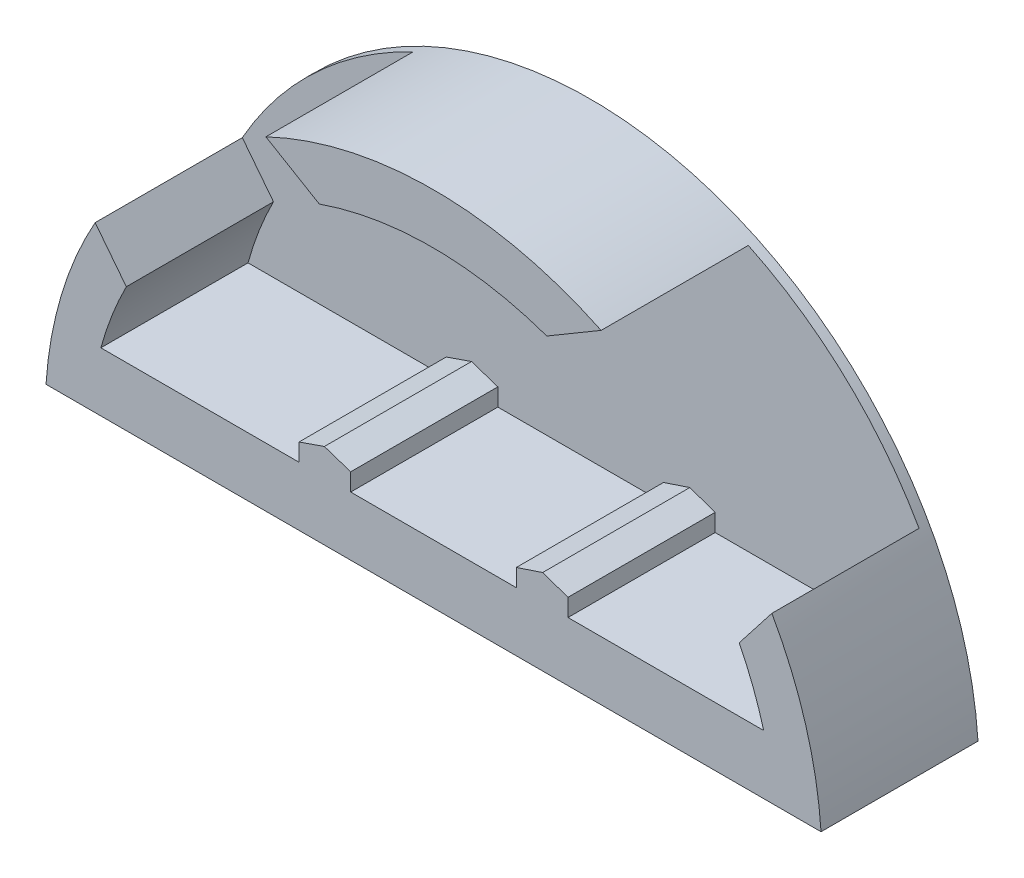
ISO-10303-21;
HEADER;
FILE_DESCRIPTION(('STEP AP214'),'2;1');
FILE_NAME('part.step','',(''),(''),'','','');
FILE_SCHEMA(('AUTOMOTIVE_DESIGN { 1 0 10303 214 1 1 1 1 }'));
ENDSEC;
DATA;
#1=APPLICATION_CONTEXT('core data for automotive mechanical design processes');
#2=APPLICATION_PROTOCOL_DEFINITION('international standard','automotive_design',2000,#1);
#3=PRODUCT_CONTEXT('',#1,'mechanical');
#4=PRODUCT('Part','Part','',(#3));
#5=PRODUCT_RELATED_PRODUCT_CATEGORY('part','',(#4));
#6=PRODUCT_DEFINITION_FORMATION('','',#4);
#7=PRODUCT_DEFINITION_CONTEXT('part definition',#1,'design');
#8=PRODUCT_DEFINITION('design','',#6,#7);
#9=PRODUCT_DEFINITION_SHAPE('','',#8);
#10=(LENGTH_UNIT() NAMED_UNIT(*) SI_UNIT(.MILLI.,.METRE.));
#11=(NAMED_UNIT(*) PLANE_ANGLE_UNIT() SI_UNIT($,.RADIAN.));
#12=(NAMED_UNIT(*) SI_UNIT($,.STERADIAN.) SOLID_ANGLE_UNIT());
#13=UNCERTAINTY_MEASURE_WITH_UNIT(LENGTH_MEASURE(1.E-05),#10,'distance_accuracy_value','');
#14=(GEOMETRIC_REPRESENTATION_CONTEXT(3) GLOBAL_UNCERTAINTY_ASSIGNED_CONTEXT((#13)) GLOBAL_UNIT_ASSIGNED_CONTEXT((#10,
#11,#12)) REPRESENTATION_CONTEXT('',''));
#15=CARTESIAN_POINT('',(0.,0.,0.));
#16=DIRECTION('',(0.,0.,1.));
#17=DIRECTION('',(1.,0.,0.));
#18=AXIS2_PLACEMENT_3D('',#15,#16,#17);
#19=CARTESIAN_POINT('',(0.,0.,3.2));
#20=DIRECTION('',(0.,0.,1.));
#21=DIRECTION('',(1.,0.,0.));
#22=AXIS2_PLACEMENT_3D('',#19,#20,#21);
#23=PLANE('',#22);
#24=DIRECTION('',(-0.861312005573637,0.508076400804759,0.));
#25=VECTOR('',#24,1.);
#26=CARTESIAN_POINT('',(-3.8663588439119,6.61080503991686,3.2));
#27=LINE('',#26,#25);
#28=CARTESIAN_POINT('',(-2.7773889019891,5.96843627564054,3.2));
#29=VERTEX_POINT('',#28);
#30=CARTESIAN_POINT('',(-3.8663588439119,6.61080503991686,3.2));
#31=VERTEX_POINT('',#30);
#32=EDGE_CURVE('E207',#29,#31,#27,.T.);
#33=ORIENTED_EDGE('',*,*,#32,.F.);
#34=CARTESIAN_POINT('',(-0.474329370102444,-0.647263744162207,3.2));
#35=DIRECTION('',(0.,0.,1.));
#36=DIRECTION('',(-1.,0.,0.));
#37=AXIS2_PLACEMENT_3D('',#34,#35,#36);
#38=CIRCLE('',#37,7.00511027460896);
#39=CARTESIAN_POINT('',(1.8603399516747,5.95734745691426,3.2));
#40=VERTEX_POINT('',#39);
#41=EDGE_CURVE('E315',#40,#29,#38,.T.);
#42=ORIENTED_EDGE('',*,*,#41,.F.);
#43=DIRECTION('',(-0.861312005573637,-0.508076400804759,0.));
#44=VECTOR('',#43,1.);
#45=CARTESIAN_POINT('',(2.96810811504892,6.61080503991686,3.2));
#46=LINE('',#45,#44);
#47=CARTESIAN_POINT('',(2.96810811504892,6.61080503991686,3.2));
#48=VERTEX_POINT('',#47);
#49=EDGE_CURVE('E224',#48,#40,#46,.T.);
#50=ORIENTED_EDGE('',*,*,#49,.F.);
#51=CARTESIAN_POINT('',(-0.449125364431487,-0.531688049222552,3.2));
#52=DIRECTION('',(0.,0.,1.));
#53=DIRECTION('',(1.,0.,0.));
#54=AXIS2_PLACEMENT_3D('',#51,#52,#53);
#55=CIRCLE('',#54,7.91787169520232);
#56=EDGE_CURVE('E342',#31,#48,#55,.F.);
#57=ORIENTED_EDGE('',*,*,#56,.F.);
#58=EDGE_LOOP('',(#33,#42,#50,#57));
#59=FACE_BOUND('',#58,.T.);
#60=ADVANCED_FACE('F43',(#59),#23,.T.);
#61=CARTESIAN_POINT('',(-0.474329370102444,-0.647263744162207,0.2));
#62=DIRECTION('',(0.,0.,1.));
#63=DIRECTION('',(1.,0.,0.));
#64=AXIS2_PLACEMENT_3D('',#61,#62,#63);
#65=CYLINDRICAL_SURFACE('',#64,7.00511027460896);
#66=ORIENTED_EDGE('',*,*,#41,.T.);
#67=DIRECTION('',(0.,0.,1.));
#68=VECTOR('',#67,1.);
#69=CARTESIAN_POINT('',(-2.7773889019891,5.96843627564054,0.2));
#70=LINE('',#69,#68);
#71=CARTESIAN_POINT('',(-2.7773889019891,5.96843627564054,0.2));
#72=VERTEX_POINT('',#71);
#73=EDGE_CURVE('E213',#72,#29,#70,.T.);
#74=ORIENTED_EDGE('',*,*,#73,.F.);
#75=CARTESIAN_POINT('',(-0.474329370102444,-0.647263744162207,0.2));
#76=DIRECTION('',(0.,0.,1.));
#77=DIRECTION('',(-1.,0.,0.));
#78=AXIS2_PLACEMENT_3D('',#75,#76,#77);
#79=CIRCLE('',#78,7.00511027460896);
#80=CARTESIAN_POINT('',(1.8603399516747,5.95734745691426,0.2));
#81=VERTEX_POINT('',#80);
#82=EDGE_CURVE('E280',#81,#72,#79,.T.);
#83=ORIENTED_EDGE('',*,*,#82,.F.);
#84=DIRECTION('',(0.,0.,1.));
#85=VECTOR('',#84,1.);
#86=CARTESIAN_POINT('',(1.8603399516747,5.95734745691426,0.2));
#87=LINE('',#86,#85);
#88=EDGE_CURVE('E237',#81,#40,#87,.T.);
#89=ORIENTED_EDGE('',*,*,#88,.T.);
#90=EDGE_LOOP('',(#66,#74,#83,#89));
#91=FACE_BOUND('',#90,.T.);
#92=ADVANCED_FACE('F373',(#91),#65,.F.);
#93=CARTESIAN_POINT('',(-6.71163372497658,2.54140437028624,0.2));
#94=VERTEX_POINT('',#93);
#95=CARTESIAN_POINT('',(-7.23055011128946,1.20342565597668,0.2));
#96=VERTEX_POINT('',#95);
#97=EDGE_CURVE('E275',#94,#96,#79,.T.);
#98=ORIENTED_EDGE('',*,*,#97,.F.);
#99=DIRECTION('',(0.,0.,1.));
#100=VECTOR('',#99,1.);
#101=CARTESIAN_POINT('',(-6.71163372497658,2.54140437028624,0.2));
#102=LINE('',#101,#100);
#103=CARTESIAN_POINT('',(-6.71163372497658,2.54140437028624,3.2));
#104=VERTEX_POINT('',#103);
#105=EDGE_CURVE('E195',#94,#104,#102,.T.);
#106=ORIENTED_EDGE('',*,*,#105,.T.);
#107=CARTESIAN_POINT('',(-7.23055011128946,1.20342565597668,3.2));
#108=VERTEX_POINT('',#107);
#109=EDGE_CURVE('E312',#104,#108,#38,.T.);
#110=ORIENTED_EDGE('',*,*,#109,.T.);
#111=DIRECTION('',(0.,0.,1.));
#112=VECTOR('',#111,1.);
#113=CARTESIAN_POINT('',(-7.23055011128946,1.20342565597668,0.2));
#114=LINE('',#113,#112);
#115=EDGE_CURVE('E316',#96,#108,#114,.T.);
#116=ORIENTED_EDGE('',*,*,#115,.F.);
#117=EDGE_LOOP('',(#98,#106,#110,#116));
#118=FACE_BOUND('',#117,.T.);
#119=ADVANCED_FACE('F379',(#118),#65,.F.);
#120=CARTESIAN_POINT('',(-0.449125364431487,-0.531688049222552,3.2));
#121=DIRECTION('',(0.,0.,-1.));
#122=DIRECTION('',(-1.,0.,0.));
#123=AXIS2_PLACEMENT_3D('',#120,#121,#122);
#124=CYLINDRICAL_SURFACE('',#123,7.91787169520232);
#125=DIRECTION('',(0.,0.,1.));
#126=VECTOR('',#125,1.);
#127=CARTESIAN_POINT('',(-3.8663588439119,6.61080503991686,0.2));
#128=LINE('',#127,#126);
#129=CARTESIAN_POINT('',(-3.8663588439119,6.61080503991686,0.2));
#130=VERTEX_POINT('',#129);
#131=EDGE_CURVE('E238',#130,#31,#128,.T.);
#132=ORIENTED_EDGE('',*,*,#131,.T.);
#133=ORIENTED_EDGE('',*,*,#56,.T.);
#134=DIRECTION('',(0.,0.,1.));
#135=VECTOR('',#134,1.);
#136=CARTESIAN_POINT('',(2.96810811504892,6.61080503991686,0.2));
#137=LINE('',#136,#135);
#138=CARTESIAN_POINT('',(2.96810811504892,6.61080503991686,0.2));
#139=VERTEX_POINT('',#138);
#140=EDGE_CURVE('E222',#139,#48,#137,.T.);
#141=ORIENTED_EDGE('',*,*,#140,.F.);
#142=CARTESIAN_POINT('',(-0.449125364431487,-0.53168804922255,0.2));
#143=DIRECTION('',(0.,0.,1.));
#144=DIRECTION('',(1.,0.,0.));
#145=AXIS2_PLACEMENT_3D('',#142,#143,#144);
#146=CIRCLE('',#145,7.91787169520232);
#147=CARTESIAN_POINT('',(6.4486623631407,3.35588402689906,0.2));
#148=VERTEX_POINT('',#147);
#149=EDGE_CURVE('E231',#148,#139,#146,.T.);
#150=ORIENTED_EDGE('',*,*,#149,.F.);
#151=DIRECTION('',(0.,0.,1.));
#152=VECTOR('',#151,1.);
#153=CARTESIAN_POINT('',(6.4486623631407,3.35588402689906,0.2));
#154=LINE('',#153,#152);
#155=CARTESIAN_POINT('',(6.4486623631407,3.35588402689906,3.2));
#156=VERTEX_POINT('',#155);
#157=EDGE_CURVE('E218',#148,#156,#154,.T.);
#158=ORIENTED_EDGE('',*,*,#157,.T.);
#159=CARTESIAN_POINT('',(7.45087463556851,0.,3.2));
#160=VERTEX_POINT('',#159);
#161=EDGE_CURVE('E343',#156,#160,#55,.F.);
#162=ORIENTED_EDGE('',*,*,#161,.T.);
#163=DIRECTION('',(0.,0.,-1.));
#164=VECTOR('',#163,1.);
#165=CARTESIAN_POINT('',(7.45087463556851,0.,3.2));
#166=LINE('',#165,#164);
#167=CARTESIAN_POINT('',(7.45087463556851,0.,0.));
#168=VERTEX_POINT('',#167);
#169=EDGE_CURVE('E51',#160,#168,#166,.T.);
#170=ORIENTED_EDGE('',*,*,#169,.T.);
#171=CARTESIAN_POINT('',(-0.449125364431487,-0.531688049222552,0.));
#172=DIRECTION('',(0.,0.,1.));
#173=DIRECTION('',(1.,0.,0.));
#174=AXIS2_PLACEMENT_3D('',#171,#172,#173);
#175=CIRCLE('',#174,7.91787169520232);
#176=CARTESIAN_POINT('',(-8.34912536443149,0.,0.));
#177=VERTEX_POINT('',#176);
#178=EDGE_CURVE('E318',#177,#168,#175,.F.);
#179=ORIENTED_EDGE('',*,*,#178,.F.);
#180=DIRECTION('',(0.,0.,-1.));
#181=VECTOR('',#180,1.);
#182=CARTESIAN_POINT('',(-8.34912536443149,0.,3.2));
#183=LINE('',#182,#181);
#184=CARTESIAN_POINT('',(-8.34912536443149,0.,3.2));
#185=VERTEX_POINT('',#184);
#186=EDGE_CURVE('E11',#185,#177,#183,.T.);
#187=ORIENTED_EDGE('',*,*,#186,.F.);
#188=CARTESIAN_POINT('',(-7.34691309200368,3.35588402689906,3.2));
#189=VERTEX_POINT('',#188);
#190=EDGE_CURVE('E211',#185,#189,#55,.F.);
#191=ORIENTED_EDGE('',*,*,#190,.T.);
#192=DIRECTION('',(0.,0.,1.));
#193=VECTOR('',#192,1.);
#194=CARTESIAN_POINT('',(-7.34691309200368,3.35588402689906,0.2));
#195=LINE('',#194,#193);
#196=CARTESIAN_POINT('',(-7.34691309200368,3.35588402689906,0.2));
#197=VERTEX_POINT('',#196);
#198=EDGE_CURVE('E192',#197,#189,#195,.T.);
#199=ORIENTED_EDGE('',*,*,#198,.F.);
#200=CARTESIAN_POINT('',(-0.449125364431487,-0.53168804922255,0.2));
#201=DIRECTION('',(0.,0.,1.));
#202=DIRECTION('',(-1.,0.,0.));
#203=AXIS2_PLACEMENT_3D('',#200,#201,#202);
#204=CIRCLE('',#203,7.91787169520232);
#205=EDGE_CURVE('E198',#130,#197,#204,.T.);
#206=ORIENTED_EDGE('',*,*,#205,.F.);
#207=EDGE_LOOP('',(#132,#133,#141,#150,#158,#162,#170,#179,#187,#191,#199,#206));
#208=FACE_BOUND('',#207,.T.);
#209=ADVANCED_FACE('F45',(#208),#124,.T.);
#210=CARTESIAN_POINT('',(0.,0.,3.2));
#211=DIRECTION('',(0.,1.,0.));
#212=DIRECTION('',(0.,0.,1.));
#213=AXIS2_PLACEMENT_3D('',#210,#211,#212);
#214=PLANE('',#213);
#215=DIRECTION('',(1.,0.,0.));
#216=VECTOR('',#215,1.);
#217=CARTESIAN_POINT('',(0.,0.,0.));
#218=LINE('',#217,#216);
#219=EDGE_CURVE('E348',#177,#168,#218,.T.);
#220=ORIENTED_EDGE('',*,*,#219,.T.);
#221=ORIENTED_EDGE('',*,*,#169,.F.);
#222=DIRECTION('',(1.,0.,0.));
#223=VECTOR('',#222,1.);
#224=CARTESIAN_POINT('',(0.,0.,3.2));
#225=LINE('',#224,#223);
#226=EDGE_CURVE('E341',#185,#160,#225,.T.);
#227=ORIENTED_EDGE('',*,*,#226,.F.);
#228=ORIENTED_EDGE('',*,*,#186,.T.);
#229=EDGE_LOOP('',(#220,#221,#227,#228));
#230=FACE_BOUND('',#229,.T.);
#231=ADVANCED_FACE('F356',(#230),#214,.F.);
#232=DIRECTION('',(0.615022911356013,-0.788509238060768,0.));
#233=VECTOR('',#232,1.);
#234=CARTESIAN_POINT('',(-6.71163372497658,2.54140437028624,3.2));
#235=LINE('',#234,#233);
#236=EDGE_CURVE('E229',#189,#104,#235,.T.);
#237=ORIENTED_EDGE('',*,*,#236,.F.);
#238=ORIENTED_EDGE('',*,*,#190,.F.);
#239=ORIENTED_EDGE('',*,*,#226,.T.);
#240=ORIENTED_EDGE('',*,*,#161,.F.);
#241=DIRECTION('',(0.615022911356013,0.788509238060768,0.));
#242=VECTOR('',#241,1.);
#243=CARTESIAN_POINT('',(5.77821970614686,2.49632218152963,3.2));
#244=LINE('',#243,#242);
#245=CARTESIAN_POINT('',(5.78283957433467,2.50224522712265,3.2));
#246=VERTEX_POINT('',#245);
#247=EDGE_CURVE('E226',#246,#156,#244,.T.);
#248=ORIENTED_EDGE('',*,*,#247,.F.);
#249=CARTESIAN_POINT('',(6.28189137108457,1.20342565597668,3.2));
#250=VERTEX_POINT('',#249);
#251=EDGE_CURVE('E245',#250,#246,#38,.T.);
#252=ORIENTED_EDGE('',*,*,#251,.F.);
#253=DIRECTION('',(1.,0.,0.));
#254=VECTOR('',#253,1.);
#255=CARTESIAN_POINT('',(2.29255265114636,1.20342565597668,3.2));
#256=LINE('',#255,#254);
#257=CARTESIAN_POINT('',(2.29255265114636,1.20342565597668,3.2));
#258=VERTEX_POINT('',#257);
#259=EDGE_CURVE('E309',#258,#250,#256,.T.);
#260=ORIENTED_EDGE('',*,*,#259,.F.);
#261=DIRECTION('',(0.,-1.,0.));
#262=VECTOR('',#261,1.);
#263=CARTESIAN_POINT('',(2.29255265114636,1.56095957900175,3.2));
#264=LINE('',#263,#262);
#265=CARTESIAN_POINT('',(2.29255265114636,1.56095957900175,3.2));
#266=VERTEX_POINT('',#265);
#267=EDGE_CURVE('E306',#266,#258,#264,.T.);
#268=ORIENTED_EDGE('',*,*,#267,.F.);
#269=DIRECTION('',(0.944986073440259,-0.327110563883164,0.));
#270=VECTOR('',#269,1.);
#271=CARTESIAN_POINT('',(1.77592776258166,1.73979127119722,3.2));
#272=LINE('',#271,#270);
#273=CARTESIAN_POINT('',(1.77592776258166,1.73979127119722,3.2));
#274=VERTEX_POINT('',#273);
#275=EDGE_CURVE('E303',#274,#266,#272,.T.);
#276=ORIENTED_EDGE('',*,*,#275,.F.);
#277=DIRECTION('',(0.948683298050513,0.316227766016839,0.));
#278=VECTOR('',#277,1.);
#279=CARTESIAN_POINT('',(1.23943268599524,1.56095957900175,3.2));
#280=LINE('',#279,#278);
#281=CARTESIAN_POINT('',(1.23943268599524,1.56095957900175,3.2));
#282=VERTEX_POINT('',#281);
#283=EDGE_CURVE('E300',#282,#274,#280,.T.);
#284=ORIENTED_EDGE('',*,*,#283,.F.);
#285=DIRECTION('',(0.,1.,0.));
#286=VECTOR('',#285,1.);
#287=CARTESIAN_POINT('',(1.23943268599524,1.20342565597668,3.2));
#288=LINE('',#287,#286);
#289=CARTESIAN_POINT('',(1.23943268599524,1.20342565597668,3.2));
#290=VERTEX_POINT('',#289);
#291=EDGE_CURVE('E297',#290,#282,#288,.T.);
#292=ORIENTED_EDGE('',*,*,#291,.F.);
#293=DIRECTION('',(1.,0.,0.));
#294=VECTOR('',#293,1.);
#295=CARTESIAN_POINT('',(-2.13768341485821,1.20342565597668,3.2));
#296=LINE('',#295,#294);
#297=CARTESIAN_POINT('',(-2.13768341485821,1.20342565597668,3.2));
#298=VERTEX_POINT('',#297);
#299=EDGE_CURVE('E294',#298,#290,#296,.T.);
#300=ORIENTED_EDGE('',*,*,#299,.F.);
#301=DIRECTION('',(0.,-1.,0.));
#302=VECTOR('',#301,1.);
#303=CARTESIAN_POINT('',(-2.13768341485821,1.56095957900175,3.2));
#304=LINE('',#303,#302);
#305=CARTESIAN_POINT('',(-2.13768341485821,1.56095957900175,3.2));
#306=VERTEX_POINT('',#305);
#307=EDGE_CURVE('E291',#306,#298,#304,.T.);
#308=ORIENTED_EDGE('',*,*,#307,.F.);
#309=DIRECTION('',(0.948683298050513,-0.316227766016839,0.));
#310=VECTOR('',#309,1.);
#311=CARTESIAN_POINT('',(-2.67417849144463,1.73979127119722,3.2));
#312=LINE('',#311,#310);
#313=CARTESIAN_POINT('',(-2.67417849144463,1.73979127119722,3.2));
#314=VERTEX_POINT('',#313);
#315=EDGE_CURVE('E288',#314,#306,#312,.T.);
#316=ORIENTED_EDGE('',*,*,#315,.F.);
#317=DIRECTION('',(0.944986073440259,0.327110563883164,0.));
#318=VECTOR('',#317,1.);
#319=CARTESIAN_POINT('',(-3.19080338000934,1.56095957900175,3.2));
#320=LINE('',#319,#318);
#321=CARTESIAN_POINT('',(-3.19080338000934,1.56095957900175,3.2));
#322=VERTEX_POINT('',#321);
#323=EDGE_CURVE('E285',#322,#314,#320,.T.);
#324=ORIENTED_EDGE('',*,*,#323,.F.);
#325=DIRECTION('',(0.,1.,0.));
#326=VECTOR('',#325,1.);
#327=CARTESIAN_POINT('',(-3.19080338000934,1.20342565597668,3.2));
#328=LINE('',#327,#326);
#329=CARTESIAN_POINT('',(-3.19080338000934,1.20342565597668,3.2));
#330=VERTEX_POINT('',#329);
#331=EDGE_CURVE('E282',#330,#322,#328,.T.);
#332=ORIENTED_EDGE('',*,*,#331,.F.);
#333=DIRECTION('',(1.,0.,0.));
#334=VECTOR('',#333,1.);
#335=CARTESIAN_POINT('',(-3.19080338000934,1.20342565597668,3.2));
#336=LINE('',#335,#334);
#337=EDGE_CURVE('E66',#108,#330,#336,.T.);
#338=ORIENTED_EDGE('',*,*,#337,.F.);
#339=ORIENTED_EDGE('',*,*,#109,.F.);
#340=EDGE_LOOP('',(#237,#238,#239,#240,#248,#252,#260,#268,#276,#284,#292,#300,#308,#316,#324,
#332,#338,#339));
#341=FACE_BOUND('',#340,.T.);
#342=ADVANCED_FACE('F361',(#341),#23,.T.);
#343=CARTESIAN_POINT('',(0.,0.,0.));
#344=DIRECTION('',(0.,0.,1.));
#345=DIRECTION('',(1.,0.,0.));
#346=AXIS2_PLACEMENT_3D('',#343,#344,#345);
#347=PLANE('',#346);
#348=ORIENTED_EDGE('',*,*,#178,.T.);
#349=ORIENTED_EDGE('',*,*,#219,.F.);
#350=EDGE_LOOP('',(#348,#349));
#351=FACE_BOUND('',#350,.T.);
#352=ADVANCED_FACE('F358',(#351),#347,.F.);
#353=CARTESIAN_POINT('',(-3.19080338000934,1.20342565597668,0.2));
#354=DIRECTION('',(0.,-1.,0.));
#355=DIRECTION('',(0.,0.,-1.));
#356=AXIS2_PLACEMENT_3D('',#353,#354,#355);
#357=PLANE('',#356);
#358=ORIENTED_EDGE('',*,*,#337,.T.);
#359=DIRECTION('',(0.,0.,1.));
#360=VECTOR('',#359,1.);
#361=CARTESIAN_POINT('',(-3.19080338000934,1.20342565597668,0.2));
#362=LINE('',#361,#360);
#363=CARTESIAN_POINT('',(-3.19080338000934,1.20342565597668,0.2));
#364=VERTEX_POINT('',#363);
#365=EDGE_CURVE('E279',#364,#330,#362,.T.);
#366=ORIENTED_EDGE('',*,*,#365,.F.);
#367=DIRECTION('',(1.,0.,0.));
#368=VECTOR('',#367,1.);
#369=CARTESIAN_POINT('',(-3.19080338000934,1.20342565597668,0.2));
#370=LINE('',#369,#368);
#371=EDGE_CURVE('E241',#96,#364,#370,.T.);
#372=ORIENTED_EDGE('',*,*,#371,.F.);
#373=ORIENTED_EDGE('',*,*,#115,.T.);
#374=EDGE_LOOP('',(#358,#366,#372,#373));
#375=FACE_BOUND('',#374,.T.);
#376=ADVANCED_FACE('F360',(#375),#357,.F.);
#377=ORIENTED_EDGE('',*,*,#251,.T.);
#378=DIRECTION('',(0.,0.,1.));
#379=VECTOR('',#378,1.);
#380=CARTESIAN_POINT('',(5.78283957433467,2.50224522712265,0.2));
#381=LINE('',#380,#379);
#382=CARTESIAN_POINT('',(5.78283957433467,2.50224522712265,0.2));
#383=VERTEX_POINT('',#382);
#384=EDGE_CURVE('E234',#246,#383,#381,.F.);
#385=ORIENTED_EDGE('',*,*,#384,.T.);
#386=CARTESIAN_POINT('',(6.28189137108457,1.20342565597668,0.2));
#387=VERTEX_POINT('',#386);
#388=EDGE_CURVE('E276',#387,#383,#79,.T.);
#389=ORIENTED_EDGE('',*,*,#388,.F.);
#390=DIRECTION('',(0.,0.,1.));
#391=VECTOR('',#390,1.);
#392=CARTESIAN_POINT('',(6.28189137108457,1.20342565597668,0.2));
#393=LINE('',#392,#391);
#394=EDGE_CURVE('E319',#387,#250,#393,.T.);
#395=ORIENTED_EDGE('',*,*,#394,.T.);
#396=EDGE_LOOP('',(#377,#385,#389,#395));
#397=FACE_BOUND('',#396,.T.);
#398=ADVANCED_FACE('F367',(#397),#65,.F.);
#399=CARTESIAN_POINT('',(2.29255265114636,1.20342565597668,0.2));
#400=DIRECTION('',(0.,-1.,0.));
#401=DIRECTION('',(0.,0.,-1.));
#402=AXIS2_PLACEMENT_3D('',#399,#400,#401);
#403=PLANE('',#402);
#404=ORIENTED_EDGE('',*,*,#259,.T.);
#405=ORIENTED_EDGE('',*,*,#394,.F.);
#406=DIRECTION('',(1.,0.,0.));
#407=VECTOR('',#406,1.);
#408=CARTESIAN_POINT('',(2.29255265114636,1.20342565597668,0.2));
#409=LINE('',#408,#407);
#410=CARTESIAN_POINT('',(2.29255265114636,1.20342565597668,0.2));
#411=VERTEX_POINT('',#410);
#412=EDGE_CURVE('E272',#411,#387,#409,.T.);
#413=ORIENTED_EDGE('',*,*,#412,.F.);
#414=DIRECTION('',(0.,0.,1.));
#415=VECTOR('',#414,1.);
#416=CARTESIAN_POINT('',(2.29255265114636,1.20342565597668,0.2));
#417=LINE('',#416,#415);
#418=EDGE_CURVE('E321',#411,#258,#417,.T.);
#419=ORIENTED_EDGE('',*,*,#418,.T.);
#420=EDGE_LOOP('',(#404,#405,#413,#419));
#421=FACE_BOUND('',#420,.T.);
#422=ADVANCED_FACE('F418',(#421),#403,.F.);
#423=CARTESIAN_POINT('',(2.29255265114636,1.56095957900175,0.2));
#424=DIRECTION('',(-1.,0.,0.));
#425=DIRECTION('',(0.,0.,1.));
#426=AXIS2_PLACEMENT_3D('',#423,#424,#425);
#427=PLANE('',#426);
#428=ORIENTED_EDGE('',*,*,#267,.T.);
#429=ORIENTED_EDGE('',*,*,#418,.F.);
#430=DIRECTION('',(0.,-1.,0.));
#431=VECTOR('',#430,1.);
#432=CARTESIAN_POINT('',(2.29255265114636,1.56095957900175,0.2));
#433=LINE('',#432,#431);
#434=CARTESIAN_POINT('',(2.29255265114636,1.56095957900175,0.2));
#435=VERTEX_POINT('',#434);
#436=EDGE_CURVE('E269',#435,#411,#433,.T.);
#437=ORIENTED_EDGE('',*,*,#436,.F.);
#438=DIRECTION('',(0.,0.,1.));
#439=VECTOR('',#438,1.);
#440=CARTESIAN_POINT('',(2.29255265114636,1.56095957900175,0.2));
#441=LINE('',#440,#439);
#442=EDGE_CURVE('E323',#435,#266,#441,.T.);
#443=ORIENTED_EDGE('',*,*,#442,.T.);
#444=EDGE_LOOP('',(#428,#429,#437,#443));
#445=FACE_BOUND('',#444,.T.);
#446=ADVANCED_FACE('F414',(#445),#427,.F.);
#447=CARTESIAN_POINT('',(1.77592776258166,1.73979127119722,0.2));
#448=DIRECTION('',(-0.327110563883164,-0.944986073440259,0.));
#449=DIRECTION('',(0.944986073440259,-0.327110563883164,0.));
#450=AXIS2_PLACEMENT_3D('',#447,#448,#449);
#451=PLANE('',#450);
#452=ORIENTED_EDGE('',*,*,#275,.T.);
#453=ORIENTED_EDGE('',*,*,#442,.F.);
#454=DIRECTION('',(0.944986073440259,-0.327110563883164,0.));
#455=VECTOR('',#454,1.);
#456=CARTESIAN_POINT('',(1.77592776258166,1.73979127119722,0.2));
#457=LINE('',#456,#455);
#458=CARTESIAN_POINT('',(1.77592776258166,1.73979127119722,0.2));
#459=VERTEX_POINT('',#458);
#460=EDGE_CURVE('E266',#459,#435,#457,.T.);
#461=ORIENTED_EDGE('',*,*,#460,.F.);
#462=DIRECTION('',(0.,0.,1.));
#463=VECTOR('',#462,1.);
#464=CARTESIAN_POINT('',(1.77592776258166,1.73979127119722,0.2));
#465=LINE('',#464,#463);
#466=EDGE_CURVE('E325',#459,#274,#465,.T.);
#467=ORIENTED_EDGE('',*,*,#466,.T.);
#468=EDGE_LOOP('',(#452,#453,#461,#467));
#469=FACE_BOUND('',#468,.T.);
#470=ADVANCED_FACE('F410',(#469),#451,.F.);
#471=CARTESIAN_POINT('',(1.23943268599524,1.56095957900175,0.2));
#472=DIRECTION('',(0.316227766016839,-0.948683298050514,0.));
#473=DIRECTION('',(0.948683298050514,0.316227766016839,0.));
#474=AXIS2_PLACEMENT_3D('',#471,#472,#473);
#475=PLANE('',#474);
#476=ORIENTED_EDGE('',*,*,#283,.T.);
#477=ORIENTED_EDGE('',*,*,#466,.F.);
#478=DIRECTION('',(0.948683298050513,0.316227766016839,0.));
#479=VECTOR('',#478,1.);
#480=CARTESIAN_POINT('',(1.23943268599524,1.56095957900175,0.2));
#481=LINE('',#480,#479);
#482=CARTESIAN_POINT('',(1.23943268599524,1.56095957900175,0.2));
#483=VERTEX_POINT('',#482);
#484=EDGE_CURVE('E263',#483,#459,#481,.T.);
#485=ORIENTED_EDGE('',*,*,#484,.F.);
#486=DIRECTION('',(0.,0.,1.));
#487=VECTOR('',#486,1.);
#488=CARTESIAN_POINT('',(1.23943268599524,1.56095957900175,0.2));
#489=LINE('',#488,#487);
#490=EDGE_CURVE('E327',#483,#282,#489,.T.);
#491=ORIENTED_EDGE('',*,*,#490,.T.);
#492=EDGE_LOOP('',(#476,#477,#485,#491));
#493=FACE_BOUND('',#492,.T.);
#494=ADVANCED_FACE('F406',(#493),#475,.F.);
#495=CARTESIAN_POINT('',(1.23943268599524,1.20342565597668,0.2));
#496=DIRECTION('',(1.,0.,0.));
#497=DIRECTION('',(0.,1.,0.));
#498=AXIS2_PLACEMENT_3D('',#495,#496,#497);
#499=PLANE('',#498);
#500=ORIENTED_EDGE('',*,*,#291,.T.);
#501=ORIENTED_EDGE('',*,*,#490,.F.);
#502=DIRECTION('',(0.,1.,0.));
#503=VECTOR('',#502,1.);
#504=CARTESIAN_POINT('',(1.23943268599524,1.20342565597668,0.2));
#505=LINE('',#504,#503);
#506=CARTESIAN_POINT('',(1.23943268599524,1.20342565597668,0.2));
#507=VERTEX_POINT('',#506);
#508=EDGE_CURVE('E260',#507,#483,#505,.T.);
#509=ORIENTED_EDGE('',*,*,#508,.F.);
#510=DIRECTION('',(0.,0.,1.));
#511=VECTOR('',#510,1.);
#512=CARTESIAN_POINT('',(1.23943268599524,1.20342565597668,0.2));
#513=LINE('',#512,#511);
#514=EDGE_CURVE('E329',#507,#290,#513,.T.);
#515=ORIENTED_EDGE('',*,*,#514,.T.);
#516=EDGE_LOOP('',(#500,#501,#509,#515));
#517=FACE_BOUND('',#516,.T.);
#518=ADVANCED_FACE('F402',(#517),#499,.F.);
#519=CARTESIAN_POINT('',(-2.13768341485821,1.20342565597668,0.2));
#520=DIRECTION('',(0.,-1.,0.));
#521=DIRECTION('',(0.,0.,-1.));
#522=AXIS2_PLACEMENT_3D('',#519,#520,#521);
#523=PLANE('',#522);
#524=ORIENTED_EDGE('',*,*,#299,.T.);
#525=ORIENTED_EDGE('',*,*,#514,.F.);
#526=DIRECTION('',(1.,0.,0.));
#527=VECTOR('',#526,1.);
#528=CARTESIAN_POINT('',(-2.13768341485821,1.20342565597668,0.2));
#529=LINE('',#528,#527);
#530=CARTESIAN_POINT('',(-2.13768341485821,1.20342565597668,0.2));
#531=VERTEX_POINT('',#530);
#532=EDGE_CURVE('E257',#531,#507,#529,.T.);
#533=ORIENTED_EDGE('',*,*,#532,.F.);
#534=DIRECTION('',(0.,0.,1.));
#535=VECTOR('',#534,1.);
#536=CARTESIAN_POINT('',(-2.13768341485821,1.20342565597668,0.2));
#537=LINE('',#536,#535);
#538=EDGE_CURVE('E331',#531,#298,#537,.T.);
#539=ORIENTED_EDGE('',*,*,#538,.T.);
#540=EDGE_LOOP('',(#524,#525,#533,#539));
#541=FACE_BOUND('',#540,.T.);
#542=ADVANCED_FACE('F398',(#541),#523,.F.);
#543=CARTESIAN_POINT('',(-2.13768341485821,1.56095957900175,0.2));
#544=DIRECTION('',(-1.,0.,0.));
#545=DIRECTION('',(0.,-1.,0.));
#546=AXIS2_PLACEMENT_3D('',#543,#544,#545);
#547=PLANE('',#546);
#548=ORIENTED_EDGE('',*,*,#307,.T.);
#549=ORIENTED_EDGE('',*,*,#538,.F.);
#550=DIRECTION('',(0.,-1.,0.));
#551=VECTOR('',#550,1.);
#552=CARTESIAN_POINT('',(-2.13768341485821,1.56095957900175,0.2));
#553=LINE('',#552,#551);
#554=CARTESIAN_POINT('',(-2.13768341485821,1.56095957900175,0.2));
#555=VERTEX_POINT('',#554);
#556=EDGE_CURVE('E254',#555,#531,#553,.T.);
#557=ORIENTED_EDGE('',*,*,#556,.F.);
#558=DIRECTION('',(0.,0.,1.));
#559=VECTOR('',#558,1.);
#560=CARTESIAN_POINT('',(-2.13768341485821,1.56095957900175,0.2));
#561=LINE('',#560,#559);
#562=EDGE_CURVE('E333',#555,#306,#561,.T.);
#563=ORIENTED_EDGE('',*,*,#562,.T.);
#564=EDGE_LOOP('',(#548,#549,#557,#563));
#565=FACE_BOUND('',#564,.T.);
#566=ADVANCED_FACE('F394',(#565),#547,.F.);
#567=CARTESIAN_POINT('',(-2.67417849144463,1.73979127119722,0.2));
#568=DIRECTION('',(-0.316227766016839,-0.948683298050514,0.));
#569=DIRECTION('',(0.948683298050514,-0.316227766016839,0.));
#570=AXIS2_PLACEMENT_3D('',#567,#568,#569);
#571=PLANE('',#570);
#572=ORIENTED_EDGE('',*,*,#315,.T.);
#573=ORIENTED_EDGE('',*,*,#562,.F.);
#574=DIRECTION('',(0.948683298050513,-0.316227766016839,0.));
#575=VECTOR('',#574,1.);
#576=CARTESIAN_POINT('',(-2.67417849144463,1.73979127119722,0.2));
#577=LINE('',#576,#575);
#578=CARTESIAN_POINT('',(-2.67417849144463,1.73979127119722,0.2));
#579=VERTEX_POINT('',#578);
#580=EDGE_CURVE('E251',#579,#555,#577,.T.);
#581=ORIENTED_EDGE('',*,*,#580,.F.);
#582=DIRECTION('',(0.,0.,1.));
#583=VECTOR('',#582,1.);
#584=CARTESIAN_POINT('',(-2.67417849144463,1.73979127119722,0.2));
#585=LINE('',#584,#583);
#586=EDGE_CURVE('E335',#579,#314,#585,.T.);
#587=ORIENTED_EDGE('',*,*,#586,.T.);
#588=EDGE_LOOP('',(#572,#573,#581,#587));
#589=FACE_BOUND('',#588,.T.);
#590=ADVANCED_FACE('F390',(#589),#571,.F.);
#591=CARTESIAN_POINT('',(-3.19080338000934,1.56095957900175,0.2));
#592=DIRECTION('',(0.327110563883164,-0.944986073440259,0.));
#593=DIRECTION('',(0.944986073440259,0.327110563883164,0.));
#594=AXIS2_PLACEMENT_3D('',#591,#592,#593);
#595=PLANE('',#594);
#596=ORIENTED_EDGE('',*,*,#323,.T.);
#597=ORIENTED_EDGE('',*,*,#586,.F.);
#598=DIRECTION('',(0.944986073440259,0.327110563883164,0.));
#599=VECTOR('',#598,1.);
#600=CARTESIAN_POINT('',(-3.19080338000934,1.56095957900175,0.2));
#601=LINE('',#600,#599);
#602=CARTESIAN_POINT('',(-3.19080338000934,1.56095957900175,0.2));
#603=VERTEX_POINT('',#602);
#604=EDGE_CURVE('E248',#603,#579,#601,.T.);
#605=ORIENTED_EDGE('',*,*,#604,.F.);
#606=DIRECTION('',(0.,0.,1.));
#607=VECTOR('',#606,1.);
#608=CARTESIAN_POINT('',(-3.19080338000934,1.56095957900175,0.2));
#609=LINE('',#608,#607);
#610=EDGE_CURVE('E337',#603,#322,#609,.T.);
#611=ORIENTED_EDGE('',*,*,#610,.T.);
#612=EDGE_LOOP('',(#596,#597,#605,#611));
#613=FACE_BOUND('',#612,.T.);
#614=ADVANCED_FACE('F386',(#613),#595,.F.);
#615=CARTESIAN_POINT('',(-3.19080338000934,1.20342565597668,0.2));
#616=DIRECTION('',(1.,0.,0.));
#617=DIRECTION('',(0.,0.,-1.));
#618=AXIS2_PLACEMENT_3D('',#615,#616,#617);
#619=PLANE('',#618);
#620=ORIENTED_EDGE('',*,*,#331,.T.);
#621=ORIENTED_EDGE('',*,*,#610,.F.);
#622=DIRECTION('',(0.,1.,0.));
#623=VECTOR('',#622,1.);
#624=CARTESIAN_POINT('',(-3.19080338000934,1.20342565597668,0.2));
#625=LINE('',#624,#623);
#626=EDGE_CURVE('E244',#364,#603,#625,.T.);
#627=ORIENTED_EDGE('',*,*,#626,.F.);
#628=ORIENTED_EDGE('',*,*,#365,.T.);
#629=EDGE_LOOP('',(#620,#621,#627,#628));
#630=FACE_BOUND('',#629,.T.);
#631=ADVANCED_FACE('F384',(#630),#619,.F.);
#632=CARTESIAN_POINT('',(-0.474329370102444,-0.647263744162207,0.2));
#633=DIRECTION('',(0.,0.,-1.));
#634=DIRECTION('',(-1.,0.,0.));
#635=AXIS2_PLACEMENT_3D('',#632,#633,#634);
#636=PLANE('',#635);
#637=DIRECTION('',(-0.861312005573637,-0.508076400804759,0.));
#638=VECTOR('',#637,1.);
#639=CARTESIAN_POINT('',(2.96810811504892,6.61080503991686,0.2));
#640=LINE('',#639,#638);
#641=EDGE_CURVE('E221',#139,#81,#640,.T.);
#642=ORIENTED_EDGE('',*,*,#641,.T.);
#643=ORIENTED_EDGE('',*,*,#82,.T.);
#644=DIRECTION('',(-0.861312005573637,0.508076400804759,0.));
#645=VECTOR('',#644,1.);
#646=CARTESIAN_POINT('',(-3.8663588439119,6.61080503991686,0.2));
#647=LINE('',#646,#645);
#648=EDGE_CURVE('E197',#72,#130,#647,.T.);
#649=ORIENTED_EDGE('',*,*,#648,.T.);
#650=ORIENTED_EDGE('',*,*,#205,.T.);
#651=DIRECTION('',(0.615022911356013,-0.788509238060768,0.));
#652=VECTOR('',#651,1.);
#653=CARTESIAN_POINT('',(-6.71163372497658,2.54140437028624,0.2));
#654=LINE('',#653,#652);
#655=EDGE_CURVE('E58',#197,#94,#654,.T.);
#656=ORIENTED_EDGE('',*,*,#655,.T.);
#657=ORIENTED_EDGE('',*,*,#97,.T.);
#658=ORIENTED_EDGE('',*,*,#371,.T.);
#659=ORIENTED_EDGE('',*,*,#626,.T.);
#660=ORIENTED_EDGE('',*,*,#604,.T.);
#661=ORIENTED_EDGE('',*,*,#580,.T.);
#662=ORIENTED_EDGE('',*,*,#556,.T.);
#663=ORIENTED_EDGE('',*,*,#532,.T.);
#664=ORIENTED_EDGE('',*,*,#508,.T.);
#665=ORIENTED_EDGE('',*,*,#484,.T.);
#666=ORIENTED_EDGE('',*,*,#460,.T.);
#667=ORIENTED_EDGE('',*,*,#436,.T.);
#668=ORIENTED_EDGE('',*,*,#412,.T.);
#669=ORIENTED_EDGE('',*,*,#388,.T.);
#670=DIRECTION('',(0.615022911356013,0.788509238060768,0.));
#671=VECTOR('',#670,1.);
#672=CARTESIAN_POINT('',(5.77821970614686,2.49632218152963,0.2));
#673=LINE('',#672,#671);
#674=EDGE_CURVE('E227',#383,#148,#673,.T.);
#675=ORIENTED_EDGE('',*,*,#674,.T.);
#676=ORIENTED_EDGE('',*,*,#149,.T.);
#677=EDGE_LOOP('',(#642,#643,#649,#650,#656,#657,#658,#659,#660,#661,#662,#663,#664,#665,#666,
#667,#668,#669,#675,#676));
#678=FACE_BOUND('',#677,.T.);
#679=ADVANCED_FACE('F203',(#678),#636,.F.);
#680=CARTESIAN_POINT('',(2.96810811504892,6.61080503991686,0.2));
#681=DIRECTION('',(-0.508076400804759,0.861312005573637,0.));
#682=DIRECTION('',(-0.861312005573637,-0.508076400804759,0.));
#683=AXIS2_PLACEMENT_3D('',#680,#681,#682);
#684=PLANE('',#683);
#685=ORIENTED_EDGE('',*,*,#641,.F.);
#686=ORIENTED_EDGE('',*,*,#140,.T.);
#687=ORIENTED_EDGE('',*,*,#49,.T.);
#688=ORIENTED_EDGE('',*,*,#88,.F.);
#689=EDGE_LOOP('',(#685,#686,#687,#688));
#690=FACE_BOUND('',#689,.T.);
#691=ADVANCED_FACE('F427',(#690),#684,.F.);
#692=CARTESIAN_POINT('',(5.77821970614686,2.49632218152963,0.2));
#693=DIRECTION('',(0.788509238060768,-0.615022911356013,0.));
#694=DIRECTION('',(0.615022911356013,0.788509238060769,0.));
#695=AXIS2_PLACEMENT_3D('',#692,#693,#694);
#696=PLANE('',#695);
#697=ORIENTED_EDGE('',*,*,#247,.T.);
#698=ORIENTED_EDGE('',*,*,#157,.F.);
#699=ORIENTED_EDGE('',*,*,#674,.F.);
#700=ORIENTED_EDGE('',*,*,#384,.F.);
#701=EDGE_LOOP('',(#697,#698,#699,#700));
#702=FACE_BOUND('',#701,.T.);
#703=ADVANCED_FACE('F430',(#702),#696,.F.);
#704=CARTESIAN_POINT('',(-3.8663588439119,6.61080503991686,0.2));
#705=DIRECTION('',(0.508076400804759,0.861312005573637,0.));
#706=DIRECTION('',(-0.861312005573637,0.508076400804759,0.));
#707=AXIS2_PLACEMENT_3D('',#704,#705,#706);
#708=PLANE('',#707);
#709=ORIENTED_EDGE('',*,*,#32,.T.);
#710=ORIENTED_EDGE('',*,*,#131,.F.);
#711=ORIENTED_EDGE('',*,*,#648,.F.);
#712=ORIENTED_EDGE('',*,*,#73,.T.);
#713=EDGE_LOOP('',(#709,#710,#711,#712));
#714=FACE_BOUND('',#713,.T.);
#715=ADVANCED_FACE('F434',(#714),#708,.F.);
#716=CARTESIAN_POINT('',(-6.71163372497658,2.54140437028624,0.2));
#717=DIRECTION('',(-0.788509238060768,-0.615022911356013,0.));
#718=DIRECTION('',(0.615022911356013,-0.788509238060768,0.));
#719=AXIS2_PLACEMENT_3D('',#716,#717,#718);
#720=PLANE('',#719);
#721=ORIENTED_EDGE('',*,*,#236,.T.);
#722=ORIENTED_EDGE('',*,*,#105,.F.);
#723=ORIENTED_EDGE('',*,*,#655,.F.);
#724=ORIENTED_EDGE('',*,*,#198,.T.);
#725=EDGE_LOOP('',(#721,#722,#723,#724));
#726=FACE_BOUND('',#725,.T.);
#727=ADVANCED_FACE('F190',(#726),#720,.F.);
#728=CLOSED_SHELL('',(#60,#92,#119,#209,#231,#342,#352,#376,#398,#422,#446,#470,#494,#518,#542,
#566,#590,#614,#631,#679,#691,#703,#715,#727));
#729=MANIFOLD_SOLID_BREP('B2',#728);
#730=ADVANCED_BREP_SHAPE_REPRESENTATION('',(#18,#729),#14);
#731=SHAPE_DEFINITION_REPRESENTATION(#9,#730);
ENDSEC;
END-ISO-10303-21;
